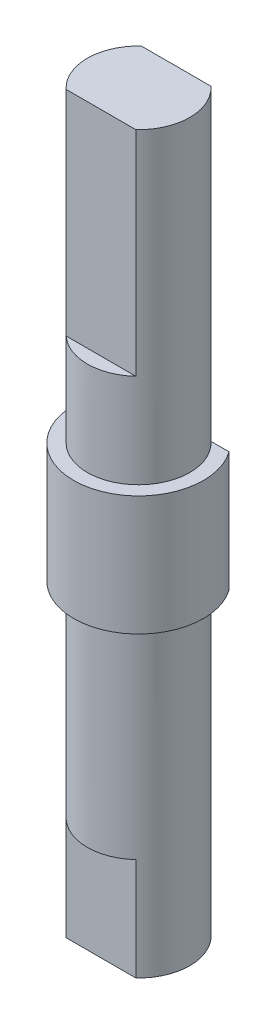
ISO-10303-21;
HEADER;
FILE_DESCRIPTION(('STEP AP214'),'2;1');
FILE_NAME('part.step','',(''),(''),'','','');
FILE_SCHEMA(('AUTOMOTIVE_DESIGN { 1 0 10303 214 1 1 1 1 }'));
ENDSEC;
DATA;
#1=APPLICATION_CONTEXT('core data for automotive mechanical design processes');
#2=APPLICATION_PROTOCOL_DEFINITION('international standard','automotive_design',2000,#1);
#3=PRODUCT_CONTEXT('',#1,'mechanical');
#4=PRODUCT('Part','Part','',(#3));
#5=PRODUCT_RELATED_PRODUCT_CATEGORY('part','',(#4));
#6=PRODUCT_DEFINITION_FORMATION('','',#4);
#7=PRODUCT_DEFINITION_CONTEXT('part definition',#1,'design');
#8=PRODUCT_DEFINITION('design','',#6,#7);
#9=PRODUCT_DEFINITION_SHAPE('','',#8);
#10=(LENGTH_UNIT() NAMED_UNIT(*) SI_UNIT(.MILLI.,.METRE.));
#11=(NAMED_UNIT(*) PLANE_ANGLE_UNIT() SI_UNIT($,.RADIAN.));
#12=(NAMED_UNIT(*) SI_UNIT($,.STERADIAN.) SOLID_ANGLE_UNIT());
#13=UNCERTAINTY_MEASURE_WITH_UNIT(LENGTH_MEASURE(1.E-05),#10,'distance_accuracy_value','');
#14=(GEOMETRIC_REPRESENTATION_CONTEXT(3) GLOBAL_UNCERTAINTY_ASSIGNED_CONTEXT((#13)) GLOBAL_UNIT_ASSIGNED_CONTEXT((#10,
#11,#12)) REPRESENTATION_CONTEXT('',''));
#15=CARTESIAN_POINT('',(0.,0.,0.));
#16=DIRECTION('',(0.,0.,1.));
#17=DIRECTION('',(1.,0.,0.));
#18=AXIS2_PLACEMENT_3D('',#15,#16,#17);
#19=CARTESIAN_POINT('',(0.,1.75,0.));
#20=DIRECTION('',(0.,-1.,0.));
#21=DIRECTION('',(0.,0.,-1.));
#22=AXIS2_PLACEMENT_3D('',#19,#20,#21);
#23=CYLINDRICAL_SURFACE('',#22,1.9);
#24=CARTESIAN_POINT('',(0.,1.75,0.));
#25=DIRECTION('',(0.,1.,0.));
#26=DIRECTION('',(0.,0.,1.));
#27=AXIS2_PLACEMENT_3D('',#24,#25,#26);
#28=CIRCLE('',#27,1.9);
#29=CARTESIAN_POINT('',(-1.54919333848297,1.75,-1.1));
#30=VERTEX_POINT('',#29);
#31=CARTESIAN_POINT('',(1.54919333848297,1.75,-1.1));
#32=VERTEX_POINT('',#31);
#33=EDGE_CURVE('E183',#30,#32,#28,.T.);
#34=ORIENTED_EDGE('',*,*,#33,.F.);
#35=DIRECTION('',(0.,1.,0.));
#36=VECTOR('',#35,1.);
#37=CARTESIAN_POINT('',(-1.54919333848297,-10.75,-1.1));
#38=LINE('',#37,#36);
#39=CARTESIAN_POINT('',(-1.54919333848297,-1.75,-1.1));
#40=VERTEX_POINT('',#39);
#41=EDGE_CURVE('E147',#40,#30,#38,.T.);
#42=ORIENTED_EDGE('',*,*,#41,.F.);
#43=CARTESIAN_POINT('',(0.,-1.75,0.));
#44=DIRECTION('',(0.,1.,0.));
#45=DIRECTION('',(0.,0.,1.));
#46=AXIS2_PLACEMENT_3D('',#43,#44,#45);
#47=CIRCLE('',#46,1.9);
#48=CARTESIAN_POINT('',(1.54919333848297,-1.75,-1.1));
#49=VERTEX_POINT('',#48);
#50=EDGE_CURVE('E180',#40,#49,#47,.T.);
#51=ORIENTED_EDGE('',*,*,#50,.T.);
#52=DIRECTION('',(0.,1.,0.));
#53=VECTOR('',#52,1.);
#54=CARTESIAN_POINT('',(1.54919333848297,-10.75,-1.1));
#55=LINE('',#54,#53);
#56=EDGE_CURVE('E148',#49,#32,#55,.T.);
#57=ORIENTED_EDGE('',*,*,#56,.T.);
#58=EDGE_LOOP('',(#34,#42,#51,#57));
#59=FACE_BOUND('',#58,.T.);
#60=ADVANCED_FACE('F37',(#59),#23,.T.);
#61=CARTESIAN_POINT('',(0.,1.75,0.));
#62=DIRECTION('',(0.,1.,0.));
#63=DIRECTION('',(0.,0.,1.));
#64=AXIS2_PLACEMENT_3D('',#61,#62,#63);
#65=PLANE('',#64);
#66=DIRECTION('',(1.,0.,0.));
#67=VECTOR('',#66,1.);
#68=CARTESIAN_POINT('',(0.,1.75,-1.1));
#69=LINE('',#68,#67);
#70=CARTESIAN_POINT('',(-1.01980390271856,1.75,-1.1));
#71=VERTEX_POINT('',#70);
#72=EDGE_CURVE('E158',#30,#71,#69,.T.);
#73=ORIENTED_EDGE('',*,*,#72,.F.);
#74=ORIENTED_EDGE('',*,*,#33,.T.);
#75=CARTESIAN_POINT('',(1.01980390271856,1.75,-1.1));
#76=VERTEX_POINT('',#75);
#77=EDGE_CURVE('E155',#76,#32,#69,.T.);
#78=ORIENTED_EDGE('',*,*,#77,.F.);
#79=CARTESIAN_POINT('',(0.,1.75,0.));
#80=DIRECTION('',(0.,1.,0.));
#81=DIRECTION('',(0.,0.,1.));
#82=AXIS2_PLACEMENT_3D('',#79,#80,#81);
#83=CIRCLE('',#82,1.5);
#84=EDGE_CURVE('E44',#71,#76,#83,.T.);
#85=ORIENTED_EDGE('',*,*,#84,.F.);
#86=EDGE_LOOP('',(#73,#74,#78,#85));
#87=FACE_BOUND('',#86,.T.);
#88=ADVANCED_FACE('F207',(#87),#65,.T.);
#89=CARTESIAN_POINT('',(0.,-1.75,0.));
#90=DIRECTION('',(0.,1.,0.));
#91=DIRECTION('',(0.,0.,1.));
#92=AXIS2_PLACEMENT_3D('',#89,#90,#91);
#93=PLANE('',#92);
#94=ORIENTED_EDGE('',*,*,#50,.F.);
#95=DIRECTION('',(1.,0.,0.));
#96=VECTOR('',#95,1.);
#97=CARTESIAN_POINT('',(0.,-1.75,-1.1));
#98=LINE('',#97,#96);
#99=CARTESIAN_POINT('',(-1.01980390271856,-1.75,-1.1));
#100=VERTEX_POINT('',#99);
#101=EDGE_CURVE('E163',#40,#100,#98,.T.);
#102=ORIENTED_EDGE('',*,*,#101,.T.);
#103=CARTESIAN_POINT('',(0.,-1.75,0.));
#104=DIRECTION('',(0.,-1.,0.));
#105=DIRECTION('',(0.,0.,-1.));
#106=AXIS2_PLACEMENT_3D('',#103,#104,#105);
#107=CIRCLE('',#106,1.5);
#108=CARTESIAN_POINT('',(1.01980390271856,-1.75,-1.1));
#109=VERTEX_POINT('',#108);
#110=EDGE_CURVE('E176',#109,#100,#107,.T.);
#111=ORIENTED_EDGE('',*,*,#110,.F.);
#112=EDGE_CURVE('E167',#109,#49,#98,.T.);
#113=ORIENTED_EDGE('',*,*,#112,.T.);
#114=EDGE_LOOP('',(#94,#102,#111,#113));
#115=FACE_BOUND('',#114,.T.);
#116=ADVANCED_FACE('F192',(#115),#93,.F.);
#117=CARTESIAN_POINT('',(0.,-10.75,0.));
#118=DIRECTION('',(0.,1.,0.));
#119=DIRECTION('',(0.,0.,1.));
#120=AXIS2_PLACEMENT_3D('',#117,#118,#119);
#121=CYLINDRICAL_SURFACE('',#120,1.5);
#122=CARTESIAN_POINT('',(0.,-10.75,0.));
#123=DIRECTION('',(0.,-1.,0.));
#124=DIRECTION('',(0.,0.,-1.));
#125=AXIS2_PLACEMENT_3D('',#122,#123,#124);
#126=CIRCLE('',#125,1.5);
#127=CARTESIAN_POINT('',(-1.01980390271856,-10.75,1.1));
#128=VERTEX_POINT('',#127);
#129=CARTESIAN_POINT('',(-1.01980390271856,-10.75,-1.1));
#130=VERTEX_POINT('',#129);
#131=EDGE_CURVE('E128',#128,#130,#126,.T.);
#132=ORIENTED_EDGE('',*,*,#131,.F.);
#133=DIRECTION('',(0.,-1.,0.));
#134=VECTOR('',#133,1.);
#135=CARTESIAN_POINT('',(-1.01980390271856,-7.75,1.1));
#136=LINE('',#135,#134);
#137=CARTESIAN_POINT('',(-1.01980390271856,-7.75,1.1));
#138=VERTEX_POINT('',#137);
#139=EDGE_CURVE('E51',#138,#128,#136,.T.);
#140=ORIENTED_EDGE('',*,*,#139,.F.);
#141=CARTESIAN_POINT('',(0.,-7.75,0.));
#142=DIRECTION('',(0.,-1.,0.));
#143=DIRECTION('',(0.,0.,1.));
#144=AXIS2_PLACEMENT_3D('',#141,#142,#143);
#145=CIRCLE('',#144,1.5);
#146=CARTESIAN_POINT('',(1.01980390271856,-7.75,1.1));
#147=VERTEX_POINT('',#146);
#148=EDGE_CURVE('E115',#147,#138,#145,.T.);
#149=ORIENTED_EDGE('',*,*,#148,.F.);
#150=DIRECTION('',(0.,-1.,0.));
#151=VECTOR('',#150,1.);
#152=CARTESIAN_POINT('',(1.01980390271856,-7.75,1.1));
#153=LINE('',#152,#151);
#154=CARTESIAN_POINT('',(1.01980390271856,-10.75,1.1));
#155=VERTEX_POINT('',#154);
#156=EDGE_CURVE('E123',#147,#155,#153,.T.);
#157=ORIENTED_EDGE('',*,*,#156,.T.);
#158=CARTESIAN_POINT('',(1.01980390271856,-10.75,-1.1));
#159=VERTEX_POINT('',#158);
#160=EDGE_CURVE('E177',#159,#155,#126,.T.);
#161=ORIENTED_EDGE('',*,*,#160,.F.);
#162=DIRECTION('',(0.,1.,0.));
#163=VECTOR('',#162,1.);
#164=CARTESIAN_POINT('',(1.01980390271856,-10.75,-1.1));
#165=LINE('',#164,#163);
#166=EDGE_CURVE('E166',#159,#109,#165,.T.);
#167=ORIENTED_EDGE('',*,*,#166,.T.);
#168=ORIENTED_EDGE('',*,*,#110,.T.);
#169=DIRECTION('',(0.,1.,0.));
#170=VECTOR('',#169,1.);
#171=CARTESIAN_POINT('',(-1.01980390271856,-10.75,-1.1));
#172=LINE('',#171,#170);
#173=EDGE_CURVE('E161',#100,#130,#172,.F.);
#174=ORIENTED_EDGE('',*,*,#173,.T.);
#175=EDGE_LOOP('',(#132,#140,#149,#157,#161,#167,#168,#174));
#176=FACE_BOUND('',#175,.T.);
#177=ADVANCED_FACE('F126',(#176),#121,.T.);
#178=CARTESIAN_POINT('',(0.,-10.75,0.));
#179=DIRECTION('',(0.,-1.,0.));
#180=DIRECTION('',(0.,0.,-1.));
#181=AXIS2_PLACEMENT_3D('',#178,#179,#180);
#182=PLANE('',#181);
#183=DIRECTION('',(1.,0.,0.));
#184=VECTOR('',#183,1.);
#185=CARTESIAN_POINT('',(-1.01980390271856,-10.75,1.1));
#186=LINE('',#185,#184);
#187=EDGE_CURVE('E120',#128,#155,#186,.T.);
#188=ORIENTED_EDGE('',*,*,#187,.F.);
#189=ORIENTED_EDGE('',*,*,#131,.T.);
#190=DIRECTION('',(1.,0.,0.));
#191=VECTOR('',#190,1.);
#192=CARTESIAN_POINT('',(-1.54919333848297,-10.75,-1.1));
#193=LINE('',#192,#191);
#194=EDGE_CURVE('E143',#130,#159,#193,.T.);
#195=ORIENTED_EDGE('',*,*,#194,.T.);
#196=ORIENTED_EDGE('',*,*,#160,.T.);
#197=EDGE_LOOP('',(#188,#189,#195,#196));
#198=FACE_BOUND('',#197,.T.);
#199=ADVANCED_FACE('F211',(#198),#182,.T.);
#200=CARTESIAN_POINT('',(0.,10.75,0.));
#201=DIRECTION('',(0.,-1.,0.));
#202=DIRECTION('',(0.,0.,-1.));
#203=AXIS2_PLACEMENT_3D('',#200,#201,#202);
#204=CYLINDRICAL_SURFACE('',#203,1.5);
#205=CARTESIAN_POINT('',(0.,10.75,0.));
#206=DIRECTION('',(0.,1.,0.));
#207=DIRECTION('',(0.,0.,1.));
#208=AXIS2_PLACEMENT_3D('',#205,#206,#207);
#209=CIRCLE('',#208,1.5);
#210=CARTESIAN_POINT('',(1.01980390271861,10.75,1.09999999999995));
#211=VERTEX_POINT('',#210);
#212=CARTESIAN_POINT('',(1.01980390271856,10.75,-1.1));
#213=VERTEX_POINT('',#212);
#214=EDGE_CURVE('E173',#211,#213,#209,.T.);
#215=ORIENTED_EDGE('',*,*,#214,.F.);
#216=DIRECTION('',(0.,1.,0.));
#217=VECTOR('',#216,1.);
#218=CARTESIAN_POINT('',(1.01980390271861,4.5,1.09999999999995));
#219=LINE('',#218,#217);
#220=CARTESIAN_POINT('',(1.01980390271861,4.5,1.09999999999995));
#221=VERTEX_POINT('',#220);
#222=EDGE_CURVE('E59',#221,#211,#219,.T.);
#223=ORIENTED_EDGE('',*,*,#222,.F.);
#224=CARTESIAN_POINT('',(0.,4.5,0.));
#225=DIRECTION('',(0.,1.,0.));
#226=DIRECTION('',(0.,0.,1.));
#227=AXIS2_PLACEMENT_3D('',#224,#225,#226);
#228=CIRCLE('',#227,1.5);
#229=CARTESIAN_POINT('',(-1.01980390271861,4.5,1.09999999999996));
#230=VERTEX_POINT('',#229);
#231=EDGE_CURVE('E134',#230,#221,#228,.T.);
#232=ORIENTED_EDGE('',*,*,#231,.F.);
#233=DIRECTION('',(0.,1.,0.));
#234=VECTOR('',#233,1.);
#235=CARTESIAN_POINT('',(-1.01980390271861,4.5,1.09999999999996));
#236=LINE('',#235,#234);
#237=CARTESIAN_POINT('',(-1.01980390271861,10.75,1.09999999999996));
#238=VERTEX_POINT('',#237);
#239=EDGE_CURVE('E140',#230,#238,#236,.T.);
#240=ORIENTED_EDGE('',*,*,#239,.T.);
#241=CARTESIAN_POINT('',(-1.01980390271856,10.75,-1.1));
#242=VERTEX_POINT('',#241);
#243=EDGE_CURVE('E170',#242,#238,#209,.T.);
#244=ORIENTED_EDGE('',*,*,#243,.F.);
#245=DIRECTION('',(0.,-1.,0.));
#246=VECTOR('',#245,1.);
#247=CARTESIAN_POINT('',(-1.01980390271856,10.75,-1.1));
#248=LINE('',#247,#246);
#249=EDGE_CURVE('E157',#242,#71,#248,.T.);
#250=ORIENTED_EDGE('',*,*,#249,.T.);
#251=ORIENTED_EDGE('',*,*,#84,.T.);
#252=DIRECTION('',(0.,-1.,0.));
#253=VECTOR('',#252,1.);
#254=CARTESIAN_POINT('',(1.01980390271856,10.75,-1.1));
#255=LINE('',#254,#253);
#256=EDGE_CURVE('E151',#76,#213,#255,.F.);
#257=ORIENTED_EDGE('',*,*,#256,.T.);
#258=EDGE_LOOP('',(#215,#223,#232,#240,#244,#250,#251,#257));
#259=FACE_BOUND('',#258,.T.);
#260=ADVANCED_FACE('F203',(#259),#204,.T.);
#261=CARTESIAN_POINT('',(0.,10.75,0.));
#262=DIRECTION('',(0.,1.,0.));
#263=DIRECTION('',(0.,0.,1.));
#264=AXIS2_PLACEMENT_3D('',#261,#262,#263);
#265=PLANE('',#264);
#266=DIRECTION('',(-1.,0.,0.));
#267=VECTOR('',#266,1.);
#268=CARTESIAN_POINT('',(1.01980390271861,10.75,1.09999999999995));
#269=LINE('',#268,#267);
#270=EDGE_CURVE('E130',#211,#238,#269,.T.);
#271=ORIENTED_EDGE('',*,*,#270,.F.);
#272=ORIENTED_EDGE('',*,*,#214,.T.);
#273=DIRECTION('',(1.,0.,0.));
#274=VECTOR('',#273,1.);
#275=CARTESIAN_POINT('',(0.,10.75,-1.1));
#276=LINE('',#275,#274);
#277=EDGE_CURVE('E11',#242,#213,#276,.T.);
#278=ORIENTED_EDGE('',*,*,#277,.F.);
#279=ORIENTED_EDGE('',*,*,#243,.T.);
#280=EDGE_LOOP('',(#271,#272,#278,#279));
#281=FACE_BOUND('',#280,.T.);
#282=ADVANCED_FACE('F198',(#281),#265,.T.);
#283=CARTESIAN_POINT('',(-1.54919333848297,-10.75,-1.1));
#284=DIRECTION('',(0.,0.,1.));
#285=DIRECTION('',(1.,0.,0.));
#286=AXIS2_PLACEMENT_3D('',#283,#284,#285);
#287=PLANE('',#286);
#288=ORIENTED_EDGE('',*,*,#166,.F.);
#289=ORIENTED_EDGE('',*,*,#194,.F.);
#290=ORIENTED_EDGE('',*,*,#173,.F.);
#291=ORIENTED_EDGE('',*,*,#101,.F.);
#292=ORIENTED_EDGE('',*,*,#41,.T.);
#293=ORIENTED_EDGE('',*,*,#72,.T.);
#294=ORIENTED_EDGE('',*,*,#249,.F.);
#295=ORIENTED_EDGE('',*,*,#277,.T.);
#296=ORIENTED_EDGE('',*,*,#256,.F.);
#297=ORIENTED_EDGE('',*,*,#77,.T.);
#298=ORIENTED_EDGE('',*,*,#56,.F.);
#299=ORIENTED_EDGE('',*,*,#112,.F.);
#300=EDGE_LOOP('',(#288,#289,#290,#291,#292,#293,#294,#295,#296,#297,#298,#299));
#301=FACE_BOUND('',#300,.T.);
#302=ADVANCED_FACE('F201',(#301),#287,.F.);
#303=CARTESIAN_POINT('',(1.01980390271861,4.5,1.09999999999995));
#304=DIRECTION('',(0.,0.,-1.));
#305=DIRECTION('',(-1.,0.,0.));
#306=AXIS2_PLACEMENT_3D('',#303,#304,#305);
#307=PLANE('',#306);
#308=ORIENTED_EDGE('',*,*,#270,.T.);
#309=ORIENTED_EDGE('',*,*,#239,.F.);
#310=DIRECTION('',(-1.,0.,0.));
#311=VECTOR('',#310,1.);
#312=CARTESIAN_POINT('',(1.01980390271861,4.5,1.09999999999995));
#313=LINE('',#312,#311);
#314=EDGE_CURVE('E136',#221,#230,#313,.T.);
#315=ORIENTED_EDGE('',*,*,#314,.F.);
#316=ORIENTED_EDGE('',*,*,#222,.T.);
#317=EDGE_LOOP('',(#308,#309,#315,#316));
#318=FACE_BOUND('',#317,.T.);
#319=ADVANCED_FACE('F268',(#318),#307,.F.);
#320=CARTESIAN_POINT('',(0.,4.5,0.));
#321=DIRECTION('',(0.,1.,0.));
#322=DIRECTION('',(0.,0.,1.));
#323=AXIS2_PLACEMENT_3D('',#320,#321,#322);
#324=PLANE('',#323);
#325=ORIENTED_EDGE('',*,*,#231,.T.);
#326=ORIENTED_EDGE('',*,*,#314,.T.);
#327=EDGE_LOOP('',(#325,#326));
#328=FACE_BOUND('',#327,.T.);
#329=ADVANCED_FACE('F241',(#328),#324,.T.);
#330=CARTESIAN_POINT('',(-1.01980390271856,-7.75,1.1));
#331=DIRECTION('',(0.,0.,-1.));
#332=DIRECTION('',(-1.,0.,0.));
#333=AXIS2_PLACEMENT_3D('',#330,#331,#332);
#334=PLANE('',#333);
#335=ORIENTED_EDGE('',*,*,#187,.T.);
#336=ORIENTED_EDGE('',*,*,#156,.F.);
#337=DIRECTION('',(1.,0.,0.));
#338=VECTOR('',#337,1.);
#339=CARTESIAN_POINT('',(-1.01980390271856,-7.75,1.1));
#340=LINE('',#339,#338);
#341=EDGE_CURVE('E117',#138,#147,#340,.T.);
#342=ORIENTED_EDGE('',*,*,#341,.F.);
#343=ORIENTED_EDGE('',*,*,#139,.T.);
#344=EDGE_LOOP('',(#335,#336,#342,#343));
#345=FACE_BOUND('',#344,.T.);
#346=ADVANCED_FACE('F122',(#345),#334,.F.);
#347=CARTESIAN_POINT('',(0.,-7.75,0.));
#348=DIRECTION('',(0.,1.,0.));
#349=DIRECTION('',(0.,0.,1.));
#350=AXIS2_PLACEMENT_3D('',#347,#348,#349);
#351=PLANE('',#350);
#352=ORIENTED_EDGE('',*,*,#148,.T.);
#353=ORIENTED_EDGE('',*,*,#341,.T.);
#354=EDGE_LOOP('',(#352,#353));
#355=FACE_BOUND('',#354,.T.);
#356=ADVANCED_FACE('F116',(#355),#351,.F.);
#357=CLOSED_SHELL('',(#60,#88,#116,#177,#199,#260,#282,#302,#319,#329,#346,#356));
#358=MANIFOLD_SOLID_BREP('B2',#357);
#359=ADVANCED_BREP_SHAPE_REPRESENTATION('',(#18,#358),#14);
#360=SHAPE_DEFINITION_REPRESENTATION(#9,#359);
ENDSEC;
END-ISO-10303-21;
